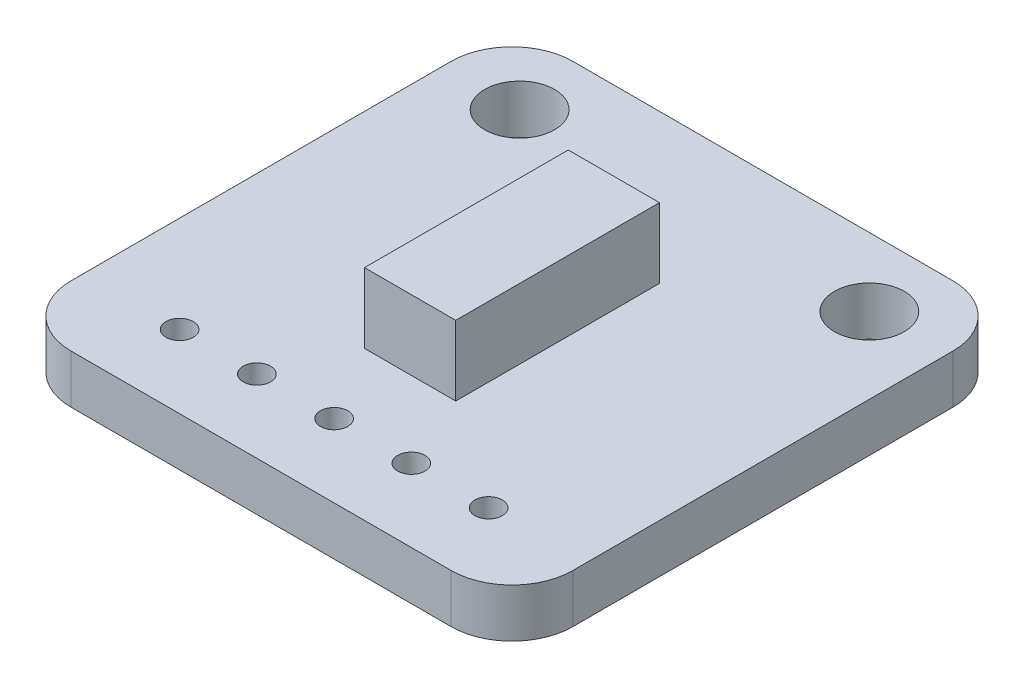
ISO-10303-21;
HEADER;
FILE_DESCRIPTION(('STEP AP214'),'2;1');
FILE_NAME('part.step','',(''),(''),'','','');
FILE_SCHEMA(('AUTOMOTIVE_DESIGN { 1 0 10303 214 1 1 1 1 }'));
ENDSEC;
DATA;
#1=APPLICATION_CONTEXT('core data for automotive mechanical design processes');
#2=APPLICATION_PROTOCOL_DEFINITION('international standard','automotive_design',2000,#1);
#3=PRODUCT_CONTEXT('',#1,'mechanical');
#4=PRODUCT('Part','Part','',(#3));
#5=PRODUCT_RELATED_PRODUCT_CATEGORY('part','',(#4));
#6=PRODUCT_DEFINITION_FORMATION('','',#4);
#7=PRODUCT_DEFINITION_CONTEXT('part definition',#1,'design');
#8=PRODUCT_DEFINITION('design','',#6,#7);
#9=PRODUCT_DEFINITION_SHAPE('','',#8);
#10=(LENGTH_UNIT() NAMED_UNIT(*) SI_UNIT(.MILLI.,.METRE.));
#11=(NAMED_UNIT(*) PLANE_ANGLE_UNIT() SI_UNIT($,.RADIAN.));
#12=(NAMED_UNIT(*) SI_UNIT($,.STERADIAN.) SOLID_ANGLE_UNIT());
#13=UNCERTAINTY_MEASURE_WITH_UNIT(LENGTH_MEASURE(1.E-05),#10,'distance_accuracy_value','');
#14=(GEOMETRIC_REPRESENTATION_CONTEXT(3) GLOBAL_UNCERTAINTY_ASSIGNED_CONTEXT((#13)) GLOBAL_UNIT_ASSIGNED_CONTEXT((#10,
#11,#12)) REPRESENTATION_CONTEXT('',''));
#15=CARTESIAN_POINT('',(0.,0.,0.));
#16=DIRECTION('',(0.,0.,1.));
#17=DIRECTION('',(1.,0.,0.));
#18=AXIS2_PLACEMENT_3D('',#15,#16,#17);
#19=CARTESIAN_POINT('',(0.,1.6,0.));
#20=DIRECTION('',(0.,-1.,0.));
#21=DIRECTION('',(0.,0.,-1.));
#22=AXIS2_PLACEMENT_3D('',#19,#20,#21);
#23=PLANE('',#22);
#24=CARTESIAN_POINT('',(-5.08,1.6,5.85));
#25=DIRECTION('',(0.,1.,0.));
#26=DIRECTION('',(0.,0.,1.));
#27=AXIS2_PLACEMENT_3D('',#24,#25,#26);
#28=CIRCLE('',#27,0.45);
#29=CARTESIAN_POINT('',(-5.08,1.6,6.3));
#30=VERTEX_POINT('',#29);
#31=EDGE_CURVE('E200',#30,#30,#28,.T.);
#32=ORIENTED_EDGE('',*,*,#31,.F.);
#33=EDGE_LOOP('',(#32));
#34=FACE_BOUND('',#33,.T.);
#35=CARTESIAN_POINT('',(-2.54,1.6,5.85));
#36=DIRECTION('',(0.,1.,0.));
#37=DIRECTION('',(0.,0.,1.));
#38=AXIS2_PLACEMENT_3D('',#35,#36,#37);
#39=CIRCLE('',#38,0.45);
#40=CARTESIAN_POINT('',(-2.54,1.6,6.3));
#41=VERTEX_POINT('',#40);
#42=EDGE_CURVE('E474',#41,#41,#39,.T.);
#43=ORIENTED_EDGE('',*,*,#42,.F.);
#44=EDGE_LOOP('',(#43));
#45=FACE_BOUND('',#44,.T.);
#46=CARTESIAN_POINT('',(0.,1.6,5.85));
#47=DIRECTION('',(0.,1.,0.));
#48=DIRECTION('',(0.,0.,1.));
#49=AXIS2_PLACEMENT_3D('',#46,#47,#48);
#50=CIRCLE('',#49,0.45);
#51=CARTESIAN_POINT('',(0.,1.6,6.3));
#52=VERTEX_POINT('',#51);
#53=EDGE_CURVE('E472',#52,#52,#50,.T.);
#54=ORIENTED_EDGE('',*,*,#53,.F.);
#55=EDGE_LOOP('',(#54));
#56=FACE_BOUND('',#55,.T.);
#57=CARTESIAN_POINT('',(2.54,1.6,5.85));
#58=DIRECTION('',(0.,1.,0.));
#59=DIRECTION('',(0.,0.,1.));
#60=AXIS2_PLACEMENT_3D('',#57,#58,#59);
#61=CIRCLE('',#60,0.45);
#62=CARTESIAN_POINT('',(2.54,1.6,6.3));
#63=VERTEX_POINT('',#62);
#64=EDGE_CURVE('E466',#63,#63,#61,.T.);
#65=ORIENTED_EDGE('',*,*,#64,.F.);
#66=EDGE_LOOP('',(#65));
#67=FACE_BOUND('',#66,.T.);
#68=CARTESIAN_POINT('',(5.08,1.6,5.85));
#69=DIRECTION('',(0.,1.,0.));
#70=DIRECTION('',(0.,0.,1.));
#71=AXIS2_PLACEMENT_3D('',#68,#69,#70);
#72=CIRCLE('',#71,0.45);
#73=CARTESIAN_POINT('',(5.08,1.6,6.3));
#74=VERTEX_POINT('',#73);
#75=EDGE_CURVE('E467',#74,#74,#72,.T.);
#76=ORIENTED_EDGE('',*,*,#75,.F.);
#77=EDGE_LOOP('',(#76));
#78=FACE_BOUND('',#77,.T.);
#79=CARTESIAN_POINT('',(5.75,1.6,-6.));
#80=DIRECTION('',(0.,1.,0.));
#81=DIRECTION('',(0.,0.,1.));
#82=AXIS2_PLACEMENT_3D('',#79,#80,#81);
#83=CIRCLE('',#82,1.15);
#84=CARTESIAN_POINT('',(5.75,1.6,-4.85));
#85=VERTEX_POINT('',#84);
#86=EDGE_CURVE('E157',#85,#85,#83,.T.);
#87=ORIENTED_EDGE('',*,*,#86,.F.);
#88=EDGE_LOOP('',(#87));
#89=FACE_BOUND('',#88,.T.);
#90=CARTESIAN_POINT('',(-5.75,1.6,-6.));
#91=DIRECTION('',(0.,1.,0.));
#92=DIRECTION('',(0.,0.,1.));
#93=AXIS2_PLACEMENT_3D('',#90,#91,#92);
#94=CIRCLE('',#93,1.15);
#95=CARTESIAN_POINT('',(-5.75,1.6,-4.85));
#96=VERTEX_POINT('',#95);
#97=EDGE_CURVE('E169',#96,#96,#94,.T.);
#98=ORIENTED_EDGE('',*,*,#97,.F.);
#99=EDGE_LOOP('',(#98));
#100=FACE_BOUND('',#99,.T.);
#101=DIRECTION('',(0.,0.,-1.));
#102=VECTOR('',#101,1.);
#103=CARTESIAN_POINT('',(8.25,1.6,8.25));
#104=LINE('',#103,#102);
#105=CARTESIAN_POINT('',(8.25,1.6,6.25));
#106=VERTEX_POINT('',#105);
#107=CARTESIAN_POINT('',(8.25,1.6,-6.25));
#108=VERTEX_POINT('',#107);
#109=EDGE_CURVE('E173',#106,#108,#104,.T.);
#110=ORIENTED_EDGE('',*,*,#109,.T.);
#111=CARTESIAN_POINT('',(6.25,1.6,-6.25));
#112=DIRECTION('',(0.,-1.,0.));
#113=DIRECTION('',(0.,0.,-1.));
#114=AXIS2_PLACEMENT_3D('',#111,#112,#113);
#115=CIRCLE('',#114,2.);
#116=CARTESIAN_POINT('',(6.25,1.6,-8.25));
#117=VERTEX_POINT('',#116);
#118=EDGE_CURVE('E234',#108,#117,#115,.F.);
#119=ORIENTED_EDGE('',*,*,#118,.T.);
#120=DIRECTION('',(-1.,0.,0.));
#121=VECTOR('',#120,1.);
#122=CARTESIAN_POINT('',(-8.25,1.6,-8.25));
#123=LINE('',#122,#121);
#124=CARTESIAN_POINT('',(-6.25,1.6,-8.25));
#125=VERTEX_POINT('',#124);
#126=EDGE_CURVE('E180',#117,#125,#123,.T.);
#127=ORIENTED_EDGE('',*,*,#126,.T.);
#128=CARTESIAN_POINT('',(-6.25,1.6,-6.25));
#129=DIRECTION('',(0.,-1.,0.));
#130=DIRECTION('',(0.,0.,-1.));
#131=AXIS2_PLACEMENT_3D('',#128,#129,#130);
#132=CIRCLE('',#131,2.);
#133=CARTESIAN_POINT('',(-8.25,1.6,-6.25));
#134=VERTEX_POINT('',#133);
#135=EDGE_CURVE('E232',#125,#134,#132,.F.);
#136=ORIENTED_EDGE('',*,*,#135,.T.);
#137=DIRECTION('',(0.,0.,1.));
#138=VECTOR('',#137,1.);
#139=CARTESIAN_POINT('',(-8.25,1.6,8.25));
#140=LINE('',#139,#138);
#141=CARTESIAN_POINT('',(-8.25,1.6,6.25));
#142=VERTEX_POINT('',#141);
#143=EDGE_CURVE('E182',#134,#142,#140,.T.);
#144=ORIENTED_EDGE('',*,*,#143,.T.);
#145=CARTESIAN_POINT('',(-6.25,1.6,6.25));
#146=DIRECTION('',(0.,-1.,0.));
#147=DIRECTION('',(0.,0.,-1.));
#148=AXIS2_PLACEMENT_3D('',#145,#146,#147);
#149=CIRCLE('',#148,2.);
#150=CARTESIAN_POINT('',(-6.25,1.6,8.25));
#151=VERTEX_POINT('',#150);
#152=EDGE_CURVE('E62',#142,#151,#149,.F.);
#153=ORIENTED_EDGE('',*,*,#152,.T.);
#154=DIRECTION('',(1.,0.,0.));
#155=VECTOR('',#154,1.);
#156=CARTESIAN_POINT('',(-8.25,1.6,8.25));
#157=LINE('',#156,#155);
#158=CARTESIAN_POINT('',(6.25,1.6,8.25));
#159=VERTEX_POINT('',#158);
#160=EDGE_CURVE('E181',#151,#159,#157,.T.);
#161=ORIENTED_EDGE('',*,*,#160,.T.);
#162=CARTESIAN_POINT('',(6.25,1.6,6.25));
#163=DIRECTION('',(0.,-1.,0.));
#164=DIRECTION('',(0.,0.,-1.));
#165=AXIS2_PLACEMENT_3D('',#162,#163,#164);
#166=CIRCLE('',#165,2.);
#167=EDGE_CURVE('E229',#159,#106,#166,.F.);
#168=ORIENTED_EDGE('',*,*,#167,.T.);
#169=EDGE_LOOP('',(#110,#119,#127,#136,#144,#153,#161,#168));
#170=FACE_BOUND('',#169,.T.);
#171=DIRECTION('',(0.,0.,-1.));
#172=VECTOR('',#171,1.);
#173=CARTESIAN_POINT('',(1.5,1.6,3.35));
#174=LINE('',#173,#172);
#175=CARTESIAN_POINT('',(1.5,1.6,3.35));
#176=VERTEX_POINT('',#175);
#177=CARTESIAN_POINT('',(1.5,1.6,-3.35));
#178=VERTEX_POINT('',#177);
#179=EDGE_CURVE('E154',#176,#178,#174,.T.);
#180=ORIENTED_EDGE('',*,*,#179,.F.);
#181=DIRECTION('',(1.,0.,0.));
#182=VECTOR('',#181,1.);
#183=CARTESIAN_POINT('',(-1.5,1.6,3.35));
#184=LINE('',#183,#182);
#185=CARTESIAN_POINT('',(-1.5,1.6,3.35));
#186=VERTEX_POINT('',#185);
#187=EDGE_CURVE('E155',#186,#176,#184,.T.);
#188=ORIENTED_EDGE('',*,*,#187,.F.);
#189=DIRECTION('',(0.,0.,1.));
#190=VECTOR('',#189,1.);
#191=CARTESIAN_POINT('',(-1.5,1.6,3.35));
#192=LINE('',#191,#190);
#193=CARTESIAN_POINT('',(-1.5,1.6,-3.35));
#194=VERTEX_POINT('',#193);
#195=EDGE_CURVE('E454',#194,#186,#192,.T.);
#196=ORIENTED_EDGE('',*,*,#195,.F.);
#197=DIRECTION('',(-1.,0.,0.));
#198=VECTOR('',#197,1.);
#199=CARTESIAN_POINT('',(-1.5,1.6,-3.35));
#200=LINE('',#199,#198);
#201=EDGE_CURVE('E453',#178,#194,#200,.T.);
#202=ORIENTED_EDGE('',*,*,#201,.F.);
#203=EDGE_LOOP('',(#180,#188,#196,#202));
#204=FACE_BOUND('',#203,.T.);
#205=ADVANCED_FACE('F41',(#34,#45,#56,#67,#78,#89,#100,#170,#204),#23,.F.);
#206=CARTESIAN_POINT('',(0.,0.,0.));
#207=DIRECTION('',(0.,-1.,0.));
#208=DIRECTION('',(0.,0.,-1.));
#209=AXIS2_PLACEMENT_3D('',#206,#207,#208);
#210=PLANE('',#209);
#211=CARTESIAN_POINT('',(-5.08,0.,5.85));
#212=DIRECTION('',(0.,-1.,0.));
#213=DIRECTION('',(0.,0.,-1.));
#214=AXIS2_PLACEMENT_3D('',#211,#212,#213);
#215=CIRCLE('',#214,0.45);
#216=CARTESIAN_POINT('',(-5.08,0.,5.4));
#217=VERTEX_POINT('',#216);
#218=EDGE_CURVE('E208',#217,#217,#215,.T.);
#219=ORIENTED_EDGE('',*,*,#218,.F.);
#220=EDGE_LOOP('',(#219));
#221=FACE_BOUND('',#220,.T.);
#222=CARTESIAN_POINT('',(-2.54,0.,5.85));
#223=DIRECTION('',(0.,-1.,0.));
#224=DIRECTION('',(0.,0.,-1.));
#225=AXIS2_PLACEMENT_3D('',#222,#223,#224);
#226=CIRCLE('',#225,0.45);
#227=CARTESIAN_POINT('',(-2.54,0.,5.4));
#228=VERTEX_POINT('',#227);
#229=EDGE_CURVE('E202',#228,#228,#226,.T.);
#230=ORIENTED_EDGE('',*,*,#229,.F.);
#231=EDGE_LOOP('',(#230));
#232=FACE_BOUND('',#231,.T.);
#233=CARTESIAN_POINT('',(0.,0.,5.85));
#234=DIRECTION('',(0.,-1.,0.));
#235=DIRECTION('',(0.,0.,-1.));
#236=AXIS2_PLACEMENT_3D('',#233,#234,#235);
#237=CIRCLE('',#236,0.45);
#238=CARTESIAN_POINT('',(0.,0.,5.4));
#239=VERTEX_POINT('',#238);
#240=EDGE_CURVE('E205',#239,#239,#237,.T.);
#241=ORIENTED_EDGE('',*,*,#240,.F.);
#242=EDGE_LOOP('',(#241));
#243=FACE_BOUND('',#242,.T.);
#244=CARTESIAN_POINT('',(2.54,0.,5.85));
#245=DIRECTION('',(0.,-1.,0.));
#246=DIRECTION('',(0.,0.,-1.));
#247=AXIS2_PLACEMENT_3D('',#244,#245,#246);
#248=CIRCLE('',#247,0.45);
#249=CARTESIAN_POINT('',(2.54,0.,5.4));
#250=VERTEX_POINT('',#249);
#251=EDGE_CURVE('E196',#250,#250,#248,.T.);
#252=ORIENTED_EDGE('',*,*,#251,.F.);
#253=EDGE_LOOP('',(#252));
#254=FACE_BOUND('',#253,.T.);
#255=CARTESIAN_POINT('',(5.08,0.,5.85));
#256=DIRECTION('',(0.,-1.,0.));
#257=DIRECTION('',(0.,0.,-1.));
#258=AXIS2_PLACEMENT_3D('',#255,#256,#257);
#259=CIRCLE('',#258,0.45);
#260=CARTESIAN_POINT('',(5.08,0.,5.4));
#261=VERTEX_POINT('',#260);
#262=EDGE_CURVE('E193',#261,#261,#259,.T.);
#263=ORIENTED_EDGE('',*,*,#262,.F.);
#264=EDGE_LOOP('',(#263));
#265=FACE_BOUND('',#264,.T.);
#266=CARTESIAN_POINT('',(-5.75,0.,-6.));
#267=DIRECTION('',(0.,1.,0.));
#268=DIRECTION('',(0.,0.,1.));
#269=AXIS2_PLACEMENT_3D('',#266,#267,#268);
#270=CIRCLE('',#269,1.15);
#271=CARTESIAN_POINT('',(-5.75,0.,-4.85));
#272=VERTEX_POINT('',#271);
#273=EDGE_CURVE('E167',#272,#272,#270,.T.);
#274=ORIENTED_EDGE('',*,*,#273,.T.);
#275=EDGE_LOOP('',(#274));
#276=FACE_BOUND('',#275,.T.);
#277=DIRECTION('',(-1.,0.,0.));
#278=VECTOR('',#277,1.);
#279=CARTESIAN_POINT('',(-8.25,0.,-8.25));
#280=LINE('',#279,#278);
#281=CARTESIAN_POINT('',(6.25,0.,-8.25));
#282=VERTEX_POINT('',#281);
#283=CARTESIAN_POINT('',(-6.25,0.,-8.25));
#284=VERTEX_POINT('',#283);
#285=EDGE_CURVE('E189',#282,#284,#280,.T.);
#286=ORIENTED_EDGE('',*,*,#285,.F.);
#287=CARTESIAN_POINT('',(6.25,0.,-6.25));
#288=DIRECTION('',(0.,-1.,0.));
#289=DIRECTION('',(0.,0.,-1.));
#290=AXIS2_PLACEMENT_3D('',#287,#288,#289);
#291=CIRCLE('',#290,2.);
#292=CARTESIAN_POINT('',(8.25,0.,-6.25));
#293=VERTEX_POINT('',#292);
#294=EDGE_CURVE('E222',#282,#293,#291,.T.);
#295=ORIENTED_EDGE('',*,*,#294,.T.);
#296=DIRECTION('',(0.,0.,-1.));
#297=VECTOR('',#296,1.);
#298=CARTESIAN_POINT('',(8.25,0.,8.25));
#299=LINE('',#298,#297);
#300=CARTESIAN_POINT('',(8.25,0.,6.25));
#301=VERTEX_POINT('',#300);
#302=EDGE_CURVE('E171',#301,#293,#299,.T.);
#303=ORIENTED_EDGE('',*,*,#302,.F.);
#304=CARTESIAN_POINT('',(6.25,0.,6.25));
#305=DIRECTION('',(0.,-1.,0.));
#306=DIRECTION('',(0.,0.,-1.));
#307=AXIS2_PLACEMENT_3D('',#304,#305,#306);
#308=CIRCLE('',#307,2.);
#309=CARTESIAN_POINT('',(6.25,0.,8.25));
#310=VERTEX_POINT('',#309);
#311=EDGE_CURVE('E214',#301,#310,#308,.T.);
#312=ORIENTED_EDGE('',*,*,#311,.T.);
#313=DIRECTION('',(1.,0.,0.));
#314=VECTOR('',#313,1.);
#315=CARTESIAN_POINT('',(-8.25,0.,8.25));
#316=LINE('',#315,#314);
#317=CARTESIAN_POINT('',(-6.25,0.,8.25));
#318=VERTEX_POINT('',#317);
#319=EDGE_CURVE('E179',#318,#310,#316,.T.);
#320=ORIENTED_EDGE('',*,*,#319,.F.);
#321=CARTESIAN_POINT('',(-6.25,0.,6.25));
#322=DIRECTION('',(0.,-1.,0.));
#323=DIRECTION('',(0.,0.,-1.));
#324=AXIS2_PLACEMENT_3D('',#321,#322,#323);
#325=CIRCLE('',#324,2.);
#326=CARTESIAN_POINT('',(-8.25,0.,6.25));
#327=VERTEX_POINT('',#326);
#328=EDGE_CURVE('E220',#318,#327,#325,.T.);
#329=ORIENTED_EDGE('',*,*,#328,.T.);
#330=DIRECTION('',(0.,0.,1.));
#331=VECTOR('',#330,1.);
#332=CARTESIAN_POINT('',(-8.25,0.,8.25));
#333=LINE('',#332,#331);
#334=CARTESIAN_POINT('',(-8.25,0.,-6.25));
#335=VERTEX_POINT('',#334);
#336=EDGE_CURVE('E192',#335,#327,#333,.T.);
#337=ORIENTED_EDGE('',*,*,#336,.F.);
#338=CARTESIAN_POINT('',(-6.25,0.,-6.25));
#339=DIRECTION('',(0.,-1.,0.));
#340=DIRECTION('',(0.,0.,-1.));
#341=AXIS2_PLACEMENT_3D('',#338,#339,#340);
#342=CIRCLE('',#341,2.);
#343=EDGE_CURVE('E218',#335,#284,#342,.T.);
#344=ORIENTED_EDGE('',*,*,#343,.T.);
#345=EDGE_LOOP('',(#286,#295,#303,#312,#320,#329,#337,#344));
#346=FACE_BOUND('',#345,.T.);
#347=CARTESIAN_POINT('',(5.75,0.,-6.));
#348=DIRECTION('',(0.,1.,0.));
#349=DIRECTION('',(0.,0.,1.));
#350=AXIS2_PLACEMENT_3D('',#347,#348,#349);
#351=CIRCLE('',#350,1.15);
#352=CARTESIAN_POINT('',(5.75,0.,-4.85));
#353=VERTEX_POINT('',#352);
#354=EDGE_CURVE('E156',#353,#353,#351,.T.);
#355=ORIENTED_EDGE('',*,*,#354,.T.);
#356=EDGE_LOOP('',(#355));
#357=FACE_BOUND('',#356,.T.);
#358=ADVANCED_FACE('F246',(#221,#232,#243,#254,#265,#276,#346,#357),#210,.T.);
#359=CARTESIAN_POINT('',(8.25,1.6,8.25));
#360=DIRECTION('',(-1.,0.,0.));
#361=DIRECTION('',(0.,0.,1.));
#362=AXIS2_PLACEMENT_3D('',#359,#360,#361);
#363=PLANE('',#362);
#364=ORIENTED_EDGE('',*,*,#302,.T.);
#365=DIRECTION('',(0.,-1.,0.));
#366=VECTOR('',#365,1.);
#367=CARTESIAN_POINT('',(8.25,1.6,-6.25));
#368=LINE('',#367,#366);
#369=EDGE_CURVE('E226',#293,#108,#368,.F.);
#370=ORIENTED_EDGE('',*,*,#369,.T.);
#371=ORIENTED_EDGE('',*,*,#109,.F.);
#372=DIRECTION('',(0.,-1.,0.));
#373=VECTOR('',#372,1.);
#374=CARTESIAN_POINT('',(8.25,1.6,6.25));
#375=LINE('',#374,#373);
#376=EDGE_CURVE('E224',#106,#301,#375,.T.);
#377=ORIENTED_EDGE('',*,*,#376,.T.);
#378=EDGE_LOOP('',(#364,#370,#371,#377));
#379=FACE_BOUND('',#378,.T.);
#380=ADVANCED_FACE('F263',(#379),#363,.F.);
#381=CARTESIAN_POINT('',(-8.25,1.6,-8.25));
#382=DIRECTION('',(0.,0.,1.));
#383=DIRECTION('',(1.,0.,0.));
#384=AXIS2_PLACEMENT_3D('',#381,#382,#383);
#385=PLANE('',#384);
#386=ORIENTED_EDGE('',*,*,#126,.F.);
#387=DIRECTION('',(0.,-1.,0.));
#388=VECTOR('',#387,1.);
#389=CARTESIAN_POINT('',(6.25,1.6,-8.25));
#390=LINE('',#389,#388);
#391=EDGE_CURVE('E215',#117,#282,#390,.T.);
#392=ORIENTED_EDGE('',*,*,#391,.T.);
#393=ORIENTED_EDGE('',*,*,#285,.T.);
#394=DIRECTION('',(0.,-1.,0.));
#395=VECTOR('',#394,1.);
#396=CARTESIAN_POINT('',(-6.25,1.6,-8.25));
#397=LINE('',#396,#395);
#398=EDGE_CURVE('E183',#284,#125,#397,.F.);
#399=ORIENTED_EDGE('',*,*,#398,.T.);
#400=EDGE_LOOP('',(#386,#392,#393,#399));
#401=FACE_BOUND('',#400,.T.);
#402=ADVANCED_FACE('F271',(#401),#385,.F.);
#403=CARTESIAN_POINT('',(-8.25,1.6,8.25));
#404=DIRECTION('',(1.,0.,0.));
#405=DIRECTION('',(0.,0.,-1.));
#406=AXIS2_PLACEMENT_3D('',#403,#404,#405);
#407=PLANE('',#406);
#408=ORIENTED_EDGE('',*,*,#143,.F.);
#409=DIRECTION('',(0.,-1.,0.));
#410=VECTOR('',#409,1.);
#411=CARTESIAN_POINT('',(-8.25,1.6,-6.25));
#412=LINE('',#411,#410);
#413=EDGE_CURVE('E240',#134,#335,#412,.T.);
#414=ORIENTED_EDGE('',*,*,#413,.T.);
#415=ORIENTED_EDGE('',*,*,#336,.T.);
#416=DIRECTION('',(0.,-1.,0.));
#417=VECTOR('',#416,1.);
#418=CARTESIAN_POINT('',(-8.25,1.6,6.25));
#419=LINE('',#418,#417);
#420=EDGE_CURVE('E233',#327,#142,#419,.F.);
#421=ORIENTED_EDGE('',*,*,#420,.T.);
#422=EDGE_LOOP('',(#408,#414,#415,#421));
#423=FACE_BOUND('',#422,.T.);
#424=ADVANCED_FACE('F244',(#423),#407,.F.);
#425=CARTESIAN_POINT('',(-8.25,1.6,8.25));
#426=DIRECTION('',(0.,0.,-1.));
#427=DIRECTION('',(-1.,0.,0.));
#428=AXIS2_PLACEMENT_3D('',#425,#426,#427);
#429=PLANE('',#428);
#430=ORIENTED_EDGE('',*,*,#160,.F.);
#431=DIRECTION('',(0.,-1.,0.));
#432=VECTOR('',#431,1.);
#433=CARTESIAN_POINT('',(-6.25,1.6,8.25));
#434=LINE('',#433,#432);
#435=EDGE_CURVE('E11',#151,#318,#434,.T.);
#436=ORIENTED_EDGE('',*,*,#435,.T.);
#437=ORIENTED_EDGE('',*,*,#319,.T.);
#438=DIRECTION('',(0.,-1.,0.));
#439=VECTOR('',#438,1.);
#440=CARTESIAN_POINT('',(6.25,1.6,8.25));
#441=LINE('',#440,#439);
#442=EDGE_CURVE('E47',#310,#159,#441,.F.);
#443=ORIENTED_EDGE('',*,*,#442,.T.);
#444=EDGE_LOOP('',(#430,#436,#437,#443));
#445=FACE_BOUND('',#444,.T.);
#446=ADVANCED_FACE('F254',(#445),#429,.F.);
#447=CARTESIAN_POINT('',(-5.75,1.6,-6.));
#448=DIRECTION('',(0.,-1.,0.));
#449=DIRECTION('',(0.,0.,-1.));
#450=AXIS2_PLACEMENT_3D('',#447,#448,#449);
#451=CYLINDRICAL_SURFACE('',#450,1.15);
#452=ORIENTED_EDGE('',*,*,#97,.T.);
#453=EDGE_LOOP('',(#452));
#454=FACE_BOUND('',#453,.T.);
#455=ORIENTED_EDGE('',*,*,#273,.F.);
#456=EDGE_LOOP('',(#455));
#457=FACE_BOUND('',#456,.T.);
#458=ADVANCED_FACE('F294',(#454,#457),#451,.F.);
#459=CARTESIAN_POINT('',(5.75,1.6,-6.));
#460=DIRECTION('',(0.,-1.,0.));
#461=DIRECTION('',(0.,0.,-1.));
#462=AXIS2_PLACEMENT_3D('',#459,#460,#461);
#463=CYLINDRICAL_SURFACE('',#462,1.15);
#464=ORIENTED_EDGE('',*,*,#86,.T.);
#465=EDGE_LOOP('',(#464));
#466=FACE_BOUND('',#465,.T.);
#467=ORIENTED_EDGE('',*,*,#354,.F.);
#468=EDGE_LOOP('',(#467));
#469=FACE_BOUND('',#468,.T.);
#470=ADVANCED_FACE('F426',(#466,#469),#463,.F.);
#471=CARTESIAN_POINT('',(1.5,3.9,3.35));
#472=DIRECTION('',(-1.,0.,0.));
#473=DIRECTION('',(0.,0.,1.));
#474=AXIS2_PLACEMENT_3D('',#471,#472,#473);
#475=PLANE('',#474);
#476=ORIENTED_EDGE('',*,*,#179,.T.);
#477=DIRECTION('',(0.,-1.,0.));
#478=VECTOR('',#477,1.);
#479=CARTESIAN_POINT('',(1.5,3.9,-3.35));
#480=LINE('',#479,#478);
#481=CARTESIAN_POINT('',(1.5,3.9,-3.35));
#482=VERTEX_POINT('',#481);
#483=EDGE_CURVE('E137',#482,#178,#480,.T.);
#484=ORIENTED_EDGE('',*,*,#483,.F.);
#485=DIRECTION('',(0.,0.,-1.));
#486=VECTOR('',#485,1.);
#487=CARTESIAN_POINT('',(1.5,3.9,3.35));
#488=LINE('',#487,#486);
#489=CARTESIAN_POINT('',(1.5,3.9,3.35));
#490=VERTEX_POINT('',#489);
#491=EDGE_CURVE('E141',#490,#482,#488,.T.);
#492=ORIENTED_EDGE('',*,*,#491,.F.);
#493=DIRECTION('',(0.,-1.,0.));
#494=VECTOR('',#493,1.);
#495=CARTESIAN_POINT('',(1.5,3.9,3.35));
#496=LINE('',#495,#494);
#497=EDGE_CURVE('E456',#490,#176,#496,.T.);
#498=ORIENTED_EDGE('',*,*,#497,.T.);
#499=EDGE_LOOP('',(#476,#484,#492,#498));
#500=FACE_BOUND('',#499,.T.);
#501=ADVANCED_FACE('F152',(#500),#475,.F.);
#502=CARTESIAN_POINT('',(-1.5,3.9,-3.35));
#503=DIRECTION('',(0.,0.,1.));
#504=DIRECTION('',(1.,0.,0.));
#505=AXIS2_PLACEMENT_3D('',#502,#503,#504);
#506=PLANE('',#505);
#507=ORIENTED_EDGE('',*,*,#201,.T.);
#508=DIRECTION('',(0.,-1.,0.));
#509=VECTOR('',#508,1.);
#510=CARTESIAN_POINT('',(-1.5,3.9,-3.35));
#511=LINE('',#510,#509);
#512=CARTESIAN_POINT('',(-1.5,3.9,-3.35));
#513=VERTEX_POINT('',#512);
#514=EDGE_CURVE('E136',#513,#194,#511,.T.);
#515=ORIENTED_EDGE('',*,*,#514,.F.);
#516=DIRECTION('',(-1.,0.,0.));
#517=VECTOR('',#516,1.);
#518=CARTESIAN_POINT('',(-1.5,3.9,-3.35));
#519=LINE('',#518,#517);
#520=EDGE_CURVE('E131',#482,#513,#519,.T.);
#521=ORIENTED_EDGE('',*,*,#520,.F.);
#522=ORIENTED_EDGE('',*,*,#483,.T.);
#523=EDGE_LOOP('',(#507,#515,#521,#522));
#524=FACE_BOUND('',#523,.T.);
#525=ADVANCED_FACE('F133',(#524),#506,.F.);
#526=CARTESIAN_POINT('',(-1.5,3.9,3.35));
#527=DIRECTION('',(1.,0.,0.));
#528=DIRECTION('',(0.,0.,-1.));
#529=AXIS2_PLACEMENT_3D('',#526,#527,#528);
#530=PLANE('',#529);
#531=ORIENTED_EDGE('',*,*,#195,.T.);
#532=DIRECTION('',(0.,-1.,0.));
#533=VECTOR('',#532,1.);
#534=CARTESIAN_POINT('',(-1.5,3.9,3.35));
#535=LINE('',#534,#533);
#536=CARTESIAN_POINT('',(-1.5,3.9,3.35));
#537=VERTEX_POINT('',#536);
#538=EDGE_CURVE('E161',#537,#186,#535,.T.);
#539=ORIENTED_EDGE('',*,*,#538,.F.);
#540=DIRECTION('',(0.,0.,1.));
#541=VECTOR('',#540,1.);
#542=CARTESIAN_POINT('',(-1.5,3.9,3.35));
#543=LINE('',#542,#541);
#544=EDGE_CURVE('E142',#513,#537,#543,.T.);
#545=ORIENTED_EDGE('',*,*,#544,.F.);
#546=ORIENTED_EDGE('',*,*,#514,.T.);
#547=EDGE_LOOP('',(#531,#539,#545,#546));
#548=FACE_BOUND('',#547,.T.);
#549=ADVANCED_FACE('F406',(#548),#530,.F.);
#550=CARTESIAN_POINT('',(-1.5,3.9,3.35));
#551=DIRECTION('',(0.,0.,-1.));
#552=DIRECTION('',(-1.,0.,0.));
#553=AXIS2_PLACEMENT_3D('',#550,#551,#552);
#554=PLANE('',#553);
#555=ORIENTED_EDGE('',*,*,#187,.T.);
#556=ORIENTED_EDGE('',*,*,#497,.F.);
#557=DIRECTION('',(1.,0.,0.));
#558=VECTOR('',#557,1.);
#559=CARTESIAN_POINT('',(-1.5,3.9,3.35));
#560=LINE('',#559,#558);
#561=EDGE_CURVE('E146',#537,#490,#560,.T.);
#562=ORIENTED_EDGE('',*,*,#561,.F.);
#563=ORIENTED_EDGE('',*,*,#538,.T.);
#564=EDGE_LOOP('',(#555,#556,#562,#563));
#565=FACE_BOUND('',#564,.T.);
#566=ADVANCED_FACE('F396',(#565),#554,.F.);
#567=CARTESIAN_POINT('',(0.,3.9,0.));
#568=DIRECTION('',(0.,-1.,0.));
#569=DIRECTION('',(0.,0.,-1.));
#570=AXIS2_PLACEMENT_3D('',#567,#568,#569);
#571=PLANE('',#570);
#572=ORIENTED_EDGE('',*,*,#491,.T.);
#573=ORIENTED_EDGE('',*,*,#520,.T.);
#574=ORIENTED_EDGE('',*,*,#544,.T.);
#575=ORIENTED_EDGE('',*,*,#561,.T.);
#576=EDGE_LOOP('',(#572,#573,#574,#575));
#577=FACE_BOUND('',#576,.T.);
#578=ADVANCED_FACE('F148',(#577),#571,.F.);
#579=CARTESIAN_POINT('',(5.08,-1.525,5.85));
#580=DIRECTION('',(0.,1.,0.));
#581=DIRECTION('',(0.,0.,1.));
#582=AXIS2_PLACEMENT_3D('',#579,#580,#581);
#583=CYLINDRICAL_SURFACE('',#582,0.45);
#584=ORIENTED_EDGE('',*,*,#262,.T.);
#585=EDGE_LOOP('',(#584));
#586=FACE_BOUND('',#585,.T.);
#587=ORIENTED_EDGE('',*,*,#75,.T.);
#588=EDGE_LOOP('',(#587));
#589=FACE_BOUND('',#588,.T.);
#590=ADVANCED_FACE('F381',(#586,#589),#583,.F.);
#591=CARTESIAN_POINT('',(2.54,-1.525,5.85));
#592=DIRECTION('',(0.,1.,0.));
#593=DIRECTION('',(0.,0.,1.));
#594=AXIS2_PLACEMENT_3D('',#591,#592,#593);
#595=CYLINDRICAL_SURFACE('',#594,0.45);
#596=ORIENTED_EDGE('',*,*,#251,.T.);
#597=EDGE_LOOP('',(#596));
#598=FACE_BOUND('',#597,.T.);
#599=ORIENTED_EDGE('',*,*,#64,.T.);
#600=EDGE_LOOP('',(#599));
#601=FACE_BOUND('',#600,.T.);
#602=ADVANCED_FACE('F371',(#598,#601),#595,.F.);
#603=CARTESIAN_POINT('',(0.,-1.525,5.85));
#604=DIRECTION('',(0.,1.,0.));
#605=DIRECTION('',(0.,0.,1.));
#606=AXIS2_PLACEMENT_3D('',#603,#604,#605);
#607=CYLINDRICAL_SURFACE('',#606,0.45);
#608=ORIENTED_EDGE('',*,*,#240,.T.);
#609=EDGE_LOOP('',(#608));
#610=FACE_BOUND('',#609,.T.);
#611=ORIENTED_EDGE('',*,*,#53,.T.);
#612=EDGE_LOOP('',(#611));
#613=FACE_BOUND('',#612,.T.);
#614=ADVANCED_FACE('F363',(#610,#613),#607,.F.);
#615=CARTESIAN_POINT('',(-2.54,-1.525,5.85));
#616=DIRECTION('',(0.,1.,0.));
#617=DIRECTION('',(0.,0.,1.));
#618=AXIS2_PLACEMENT_3D('',#615,#616,#617);
#619=CYLINDRICAL_SURFACE('',#618,0.45);
#620=ORIENTED_EDGE('',*,*,#229,.T.);
#621=EDGE_LOOP('',(#620));
#622=FACE_BOUND('',#621,.T.);
#623=ORIENTED_EDGE('',*,*,#42,.T.);
#624=EDGE_LOOP('',(#623));
#625=FACE_BOUND('',#624,.T.);
#626=ADVANCED_FACE('F351',(#622,#625),#619,.F.);
#627=CARTESIAN_POINT('',(-5.08,-1.525,5.85));
#628=DIRECTION('',(0.,1.,0.));
#629=DIRECTION('',(0.,0.,1.));
#630=AXIS2_PLACEMENT_3D('',#627,#628,#629);
#631=CYLINDRICAL_SURFACE('',#630,0.45);
#632=ORIENTED_EDGE('',*,*,#218,.T.);
#633=EDGE_LOOP('',(#632));
#634=FACE_BOUND('',#633,.T.);
#635=ORIENTED_EDGE('',*,*,#31,.T.);
#636=EDGE_LOOP('',(#635));
#637=FACE_BOUND('',#636,.T.);
#638=ADVANCED_FACE('F278',(#634,#637),#631,.F.);
#639=CARTESIAN_POINT('',(6.25,1.6,-6.25));
#640=DIRECTION('',(0.,-1.,0.));
#641=DIRECTION('',(0.,0.,-1.));
#642=AXIS2_PLACEMENT_3D('',#639,#640,#641);
#643=CYLINDRICAL_SURFACE('',#642,2.);
#644=ORIENTED_EDGE('',*,*,#118,.F.);
#645=ORIENTED_EDGE('',*,*,#369,.F.);
#646=ORIENTED_EDGE('',*,*,#294,.F.);
#647=ORIENTED_EDGE('',*,*,#391,.F.);
#648=EDGE_LOOP('',(#644,#645,#646,#647));
#649=FACE_BOUND('',#648,.T.);
#650=ADVANCED_FACE('F268',(#649),#643,.T.);
#651=CARTESIAN_POINT('',(-6.25,1.6,-6.25));
#652=DIRECTION('',(0.,-1.,0.));
#653=DIRECTION('',(0.,0.,-1.));
#654=AXIS2_PLACEMENT_3D('',#651,#652,#653);
#655=CYLINDRICAL_SURFACE('',#654,2.);
#656=ORIENTED_EDGE('',*,*,#135,.F.);
#657=ORIENTED_EDGE('',*,*,#398,.F.);
#658=ORIENTED_EDGE('',*,*,#343,.F.);
#659=ORIENTED_EDGE('',*,*,#413,.F.);
#660=EDGE_LOOP('',(#656,#657,#658,#659));
#661=FACE_BOUND('',#660,.T.);
#662=ADVANCED_FACE('F272',(#661),#655,.T.);
#663=CARTESIAN_POINT('',(-6.25,1.6,6.25));
#664=DIRECTION('',(0.,-1.,0.));
#665=DIRECTION('',(0.,0.,-1.));
#666=AXIS2_PLACEMENT_3D('',#663,#664,#665);
#667=CYLINDRICAL_SURFACE('',#666,2.);
#668=ORIENTED_EDGE('',*,*,#152,.F.);
#669=ORIENTED_EDGE('',*,*,#420,.F.);
#670=ORIENTED_EDGE('',*,*,#328,.F.);
#671=ORIENTED_EDGE('',*,*,#435,.F.);
#672=EDGE_LOOP('',(#668,#669,#670,#671));
#673=FACE_BOUND('',#672,.T.);
#674=ADVANCED_FACE('F255',(#673),#667,.T.);
#675=CARTESIAN_POINT('',(6.25,1.6,6.25));
#676=DIRECTION('',(0.,-1.,0.));
#677=DIRECTION('',(0.,0.,-1.));
#678=AXIS2_PLACEMENT_3D('',#675,#676,#677);
#679=CYLINDRICAL_SURFACE('',#678,2.);
#680=ORIENTED_EDGE('',*,*,#167,.F.);
#681=ORIENTED_EDGE('',*,*,#442,.F.);
#682=ORIENTED_EDGE('',*,*,#311,.F.);
#683=ORIENTED_EDGE('',*,*,#376,.F.);
#684=EDGE_LOOP('',(#680,#681,#682,#683));
#685=FACE_BOUND('',#684,.T.);
#686=ADVANCED_FACE('F43',(#685),#679,.T.);
#687=CLOSED_SHELL('',(#205,#358,#380,#402,#424,#446,#458,#470,#501,#525,#549,#566,#578,#590,
#602,#614,#626,#638,#650,#662,#674,#686));
#688=MANIFOLD_SOLID_BREP('B2',#687);
#689=ADVANCED_BREP_SHAPE_REPRESENTATION('',(#18,#688),#14);
#690=SHAPE_DEFINITION_REPRESENTATION(#9,#689);
ENDSEC;
END-ISO-10303-21;
